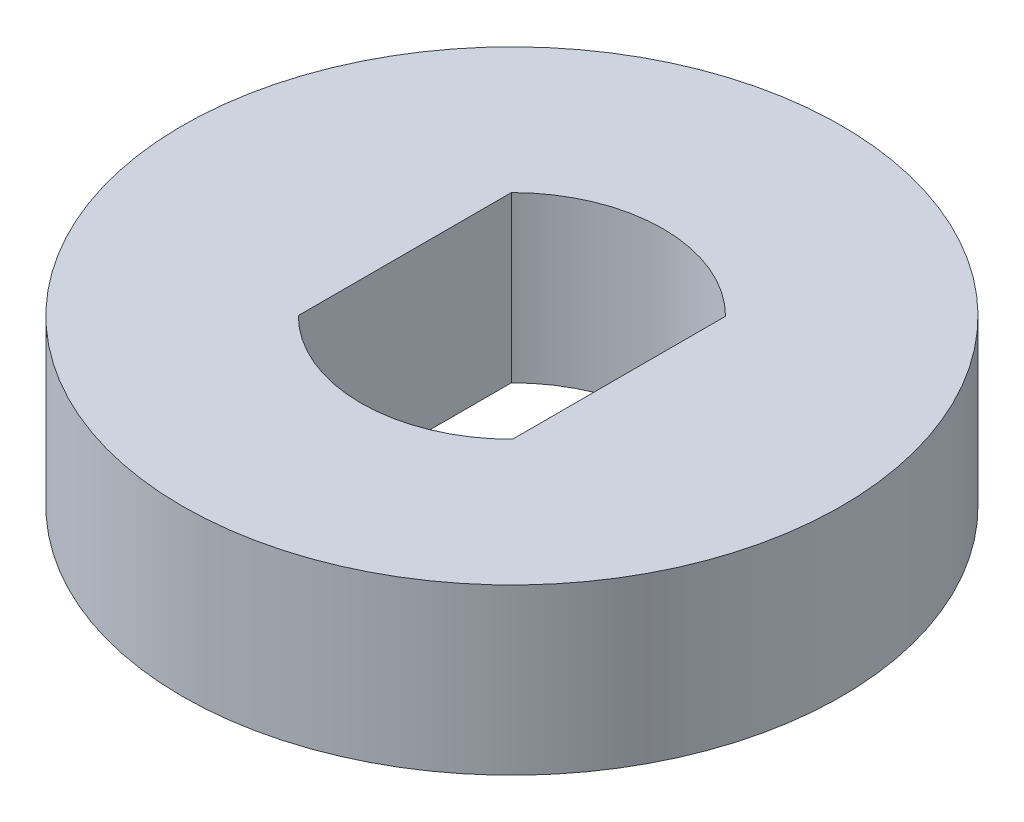
ISO-10303-21;
HEADER;
FILE_DESCRIPTION(('STEP AP214'),'2;1');
FILE_NAME('part.step','',(''),(''),'','','');
FILE_SCHEMA(('AUTOMOTIVE_DESIGN { 1 0 10303 214 1 1 1 1 }'));
ENDSEC;
DATA;
#1=APPLICATION_CONTEXT('core data for automotive mechanical design processes');
#2=APPLICATION_PROTOCOL_DEFINITION('international standard','automotive_design',2000,#1);
#3=PRODUCT_CONTEXT('',#1,'mechanical');
#4=PRODUCT('Part','Part','',(#3));
#5=PRODUCT_RELATED_PRODUCT_CATEGORY('part','',(#4));
#6=PRODUCT_DEFINITION_FORMATION('','',#4);
#7=PRODUCT_DEFINITION_CONTEXT('part definition',#1,'design');
#8=PRODUCT_DEFINITION('design','',#6,#7);
#9=PRODUCT_DEFINITION_SHAPE('','',#8);
#10=(LENGTH_UNIT() NAMED_UNIT(*) SI_UNIT(.MILLI.,.METRE.));
#11=(NAMED_UNIT(*) PLANE_ANGLE_UNIT() SI_UNIT($,.RADIAN.));
#12=(NAMED_UNIT(*) SI_UNIT($,.STERADIAN.) SOLID_ANGLE_UNIT());
#13=UNCERTAINTY_MEASURE_WITH_UNIT(LENGTH_MEASURE(1.E-05),#10,'distance_accuracy_value','');
#14=(GEOMETRIC_REPRESENTATION_CONTEXT(3) GLOBAL_UNCERTAINTY_ASSIGNED_CONTEXT((#13)) GLOBAL_UNIT_ASSIGNED_CONTEXT((#10,
#11,#12)) REPRESENTATION_CONTEXT('',''));
#15=CARTESIAN_POINT('',(0.,0.,0.));
#16=DIRECTION('',(0.,0.,1.));
#17=DIRECTION('',(1.,0.,0.));
#18=AXIS2_PLACEMENT_3D('',#15,#16,#17);
#19=CARTESIAN_POINT('',(1.95,3.,0.));
#20=DIRECTION('',(1.,0.,0.));
#21=DIRECTION('',(0.,0.,-1.));
#22=AXIS2_PLACEMENT_3D('',#19,#20,#21);
#23=PLANE('',#22);
#24=DIRECTION('',(0.,0.,1.));
#25=VECTOR('',#24,1.);
#26=CARTESIAN_POINT('',(1.95,0.,0.));
#27=LINE('',#26,#25);
#28=CARTESIAN_POINT('',(1.95,0.,-1.93907194296653));
#29=VERTEX_POINT('',#28);
#30=CARTESIAN_POINT('',(1.95,0.,1.93907194296653));
#31=VERTEX_POINT('',#30);
#32=EDGE_CURVE('E101',#29,#31,#27,.T.);
#33=ORIENTED_EDGE('',*,*,#32,.T.);
#34=DIRECTION('',(0.,-1.,0.));
#35=VECTOR('',#34,1.);
#36=CARTESIAN_POINT('',(1.95,3.,1.93907194296653));
#37=LINE('',#36,#35);
#38=CARTESIAN_POINT('',(1.95,3.,1.93907194296653));
#39=VERTEX_POINT('',#38);
#40=EDGE_CURVE('E11',#39,#31,#37,.T.);
#41=ORIENTED_EDGE('',*,*,#40,.F.);
#42=DIRECTION('',(0.,0.,1.));
#43=VECTOR('',#42,1.);
#44=CARTESIAN_POINT('',(1.95,3.,0.));
#45=LINE('',#44,#43);
#46=CARTESIAN_POINT('',(1.95,3.,-1.93907194296653));
#47=VERTEX_POINT('',#46);
#48=EDGE_CURVE('E75',#47,#39,#45,.T.);
#49=ORIENTED_EDGE('',*,*,#48,.F.);
#50=DIRECTION('',(0.,-1.,0.));
#51=VECTOR('',#50,1.);
#52=CARTESIAN_POINT('',(1.95,3.,-1.93907194296653));
#53=LINE('',#52,#51);
#54=EDGE_CURVE('E51',#47,#29,#53,.T.);
#55=ORIENTED_EDGE('',*,*,#54,.T.);
#56=EDGE_LOOP('',(#33,#41,#49,#55));
#57=FACE_BOUND('',#56,.T.);
#58=ADVANCED_FACE('F34',(#57),#23,.F.);
#59=CARTESIAN_POINT('',(0.,3.,0.));
#60=DIRECTION('',(0.,-1.,0.));
#61=DIRECTION('',(0.,0.,-1.));
#62=AXIS2_PLACEMENT_3D('',#59,#60,#61);
#63=CYLINDRICAL_SURFACE('',#62,2.75);
#64=CARTESIAN_POINT('',(0.,0.,0.));
#65=DIRECTION('',(0.,1.,0.));
#66=DIRECTION('',(0.,0.,1.));
#67=AXIS2_PLACEMENT_3D('',#64,#65,#66);
#68=CIRCLE('',#67,2.75);
#69=CARTESIAN_POINT('',(-1.95,0.,1.93907194296653));
#70=VERTEX_POINT('',#69);
#71=EDGE_CURVE('E84',#70,#31,#68,.T.);
#72=ORIENTED_EDGE('',*,*,#71,.F.);
#73=DIRECTION('',(0.,-1.,0.));
#74=VECTOR('',#73,1.);
#75=CARTESIAN_POINT('',(-1.95,3.,1.93907194296653));
#76=LINE('',#75,#74);
#77=CARTESIAN_POINT('',(-1.95,3.,1.93907194296653));
#78=VERTEX_POINT('',#77);
#79=EDGE_CURVE('E43',#78,#70,#76,.T.);
#80=ORIENTED_EDGE('',*,*,#79,.F.);
#81=CARTESIAN_POINT('',(0.,3.,0.));
#82=DIRECTION('',(0.,1.,0.));
#83=DIRECTION('',(0.,0.,1.));
#84=AXIS2_PLACEMENT_3D('',#81,#82,#83);
#85=CIRCLE('',#84,2.75);
#86=EDGE_CURVE('E82',#78,#39,#85,.T.);
#87=ORIENTED_EDGE('',*,*,#86,.T.);
#88=ORIENTED_EDGE('',*,*,#40,.T.);
#89=EDGE_LOOP('',(#72,#80,#87,#88));
#90=FACE_BOUND('',#89,.T.);
#91=ADVANCED_FACE('F81',(#90),#63,.F.);
#92=CARTESIAN_POINT('',(-1.95,3.,0.));
#93=DIRECTION('',(1.,0.,0.));
#94=DIRECTION('',(0.,0.,-1.));
#95=AXIS2_PLACEMENT_3D('',#92,#93,#94);
#96=PLANE('',#95);
#97=DIRECTION('',(0.,0.,1.));
#98=VECTOR('',#97,1.);
#99=CARTESIAN_POINT('',(-1.95,0.,0.));
#100=LINE('',#99,#98);
#101=CARTESIAN_POINT('',(-1.95,0.,-1.93907194296653));
#102=VERTEX_POINT('',#101);
#103=EDGE_CURVE('E104',#102,#70,#100,.T.);
#104=ORIENTED_EDGE('',*,*,#103,.F.);
#105=DIRECTION('',(0.,-1.,0.));
#106=VECTOR('',#105,1.);
#107=CARTESIAN_POINT('',(-1.95,3.,-1.93907194296653));
#108=LINE('',#107,#106);
#109=CARTESIAN_POINT('',(-1.95,3.,-1.93907194296653));
#110=VERTEX_POINT('',#109);
#111=EDGE_CURVE('E64',#110,#102,#108,.T.);
#112=ORIENTED_EDGE('',*,*,#111,.F.);
#113=DIRECTION('',(0.,0.,1.));
#114=VECTOR('',#113,1.);
#115=CARTESIAN_POINT('',(-1.95,3.,0.));
#116=LINE('',#115,#114);
#117=EDGE_CURVE('E90',#110,#78,#116,.T.);
#118=ORIENTED_EDGE('',*,*,#117,.T.);
#119=ORIENTED_EDGE('',*,*,#79,.T.);
#120=EDGE_LOOP('',(#104,#112,#118,#119));
#121=FACE_BOUND('',#120,.T.);
#122=ADVANCED_FACE('F92',(#121),#96,.T.);
#123=CARTESIAN_POINT('',(0.,3.,0.));
#124=DIRECTION('',(0.,-1.,0.));
#125=DIRECTION('',(0.,0.,-1.));
#126=AXIS2_PLACEMENT_3D('',#123,#124,#125);
#127=CYLINDRICAL_SURFACE('',#126,6.);
#128=CARTESIAN_POINT('',(0.,3.,0.));
#129=DIRECTION('',(0.,1.,0.));
#130=DIRECTION('',(0.,0.,1.));
#131=AXIS2_PLACEMENT_3D('',#128,#129,#130);
#132=CIRCLE('',#131,6.);
#133=CARTESIAN_POINT('',(0.,3.,6.));
#134=VERTEX_POINT('',#133);
#135=EDGE_CURVE('E109',#134,#134,#132,.T.);
#136=ORIENTED_EDGE('',*,*,#135,.F.);
#137=EDGE_LOOP('',(#136));
#138=FACE_BOUND('',#137,.T.);
#139=CARTESIAN_POINT('',(0.,0.,0.));
#140=DIRECTION('',(0.,1.,0.));
#141=DIRECTION('',(0.,0.,1.));
#142=AXIS2_PLACEMENT_3D('',#139,#140,#141);
#143=CIRCLE('',#142,6.);
#144=CARTESIAN_POINT('',(0.,0.,6.));
#145=VERTEX_POINT('',#144);
#146=EDGE_CURVE('E98',#145,#145,#143,.T.);
#147=ORIENTED_EDGE('',*,*,#146,.T.);
#148=EDGE_LOOP('',(#147));
#149=FACE_BOUND('',#148,.T.);
#150=ADVANCED_FACE('F36',(#138,#149),#127,.T.);
#151=CARTESIAN_POINT('',(0.,3.,0.));
#152=DIRECTION('',(0.,-1.,0.));
#153=DIRECTION('',(0.,0.,-1.));
#154=AXIS2_PLACEMENT_3D('',#151,#152,#153);
#155=CYLINDRICAL_SURFACE('',#154,2.75);
#156=CARTESIAN_POINT('',(0.,0.,0.));
#157=DIRECTION('',(0.,1.,0.));
#158=DIRECTION('',(0.,0.,1.));
#159=AXIS2_PLACEMENT_3D('',#156,#157,#158);
#160=CIRCLE('',#159,2.75);
#161=EDGE_CURVE('E106',#29,#102,#160,.T.);
#162=ORIENTED_EDGE('',*,*,#161,.F.);
#163=ORIENTED_EDGE('',*,*,#54,.F.);
#164=CARTESIAN_POINT('',(0.,3.,0.));
#165=DIRECTION('',(0.,1.,0.));
#166=DIRECTION('',(0.,0.,1.));
#167=AXIS2_PLACEMENT_3D('',#164,#165,#166);
#168=CIRCLE('',#167,2.75);
#169=EDGE_CURVE('E93',#47,#110,#168,.T.);
#170=ORIENTED_EDGE('',*,*,#169,.T.);
#171=ORIENTED_EDGE('',*,*,#111,.T.);
#172=EDGE_LOOP('',(#162,#163,#170,#171));
#173=FACE_BOUND('',#172,.T.);
#174=ADVANCED_FACE('F119',(#173),#155,.F.);
#175=CARTESIAN_POINT('',(0.,3.,0.));
#176=DIRECTION('',(0.,1.,0.));
#177=DIRECTION('',(0.,0.,1.));
#178=AXIS2_PLACEMENT_3D('',#175,#176,#177);
#179=PLANE('',#178);
#180=ORIENTED_EDGE('',*,*,#135,.T.);
#181=EDGE_LOOP('',(#180));
#182=FACE_BOUND('',#181,.T.);
#183=ORIENTED_EDGE('',*,*,#48,.T.);
#184=ORIENTED_EDGE('',*,*,#86,.F.);
#185=ORIENTED_EDGE('',*,*,#117,.F.);
#186=ORIENTED_EDGE('',*,*,#169,.F.);
#187=EDGE_LOOP('',(#183,#184,#185,#186));
#188=FACE_BOUND('',#187,.T.);
#189=ADVANCED_FACE('F89',(#182,#188),#179,.T.);
#190=CARTESIAN_POINT('',(0.,0.,0.));
#191=DIRECTION('',(0.,1.,0.));
#192=DIRECTION('',(0.,0.,1.));
#193=AXIS2_PLACEMENT_3D('',#190,#191,#192);
#194=PLANE('',#193);
#195=ORIENTED_EDGE('',*,*,#146,.F.);
#196=EDGE_LOOP('',(#195));
#197=FACE_BOUND('',#196,.T.);
#198=ORIENTED_EDGE('',*,*,#32,.F.);
#199=ORIENTED_EDGE('',*,*,#161,.T.);
#200=ORIENTED_EDGE('',*,*,#103,.T.);
#201=ORIENTED_EDGE('',*,*,#71,.T.);
#202=EDGE_LOOP('',(#198,#199,#200,#201));
#203=FACE_BOUND('',#202,.T.);
#204=ADVANCED_FACE('F122',(#197,#203),#194,.F.);
#205=CLOSED_SHELL('',(#58,#91,#122,#150,#174,#189,#204));
#206=MANIFOLD_SOLID_BREP('B2',#205);
#207=ADVANCED_BREP_SHAPE_REPRESENTATION('',(#18,#206),#14);
#208=SHAPE_DEFINITION_REPRESENTATION(#9,#207);
ENDSEC;
END-ISO-10303-21;
